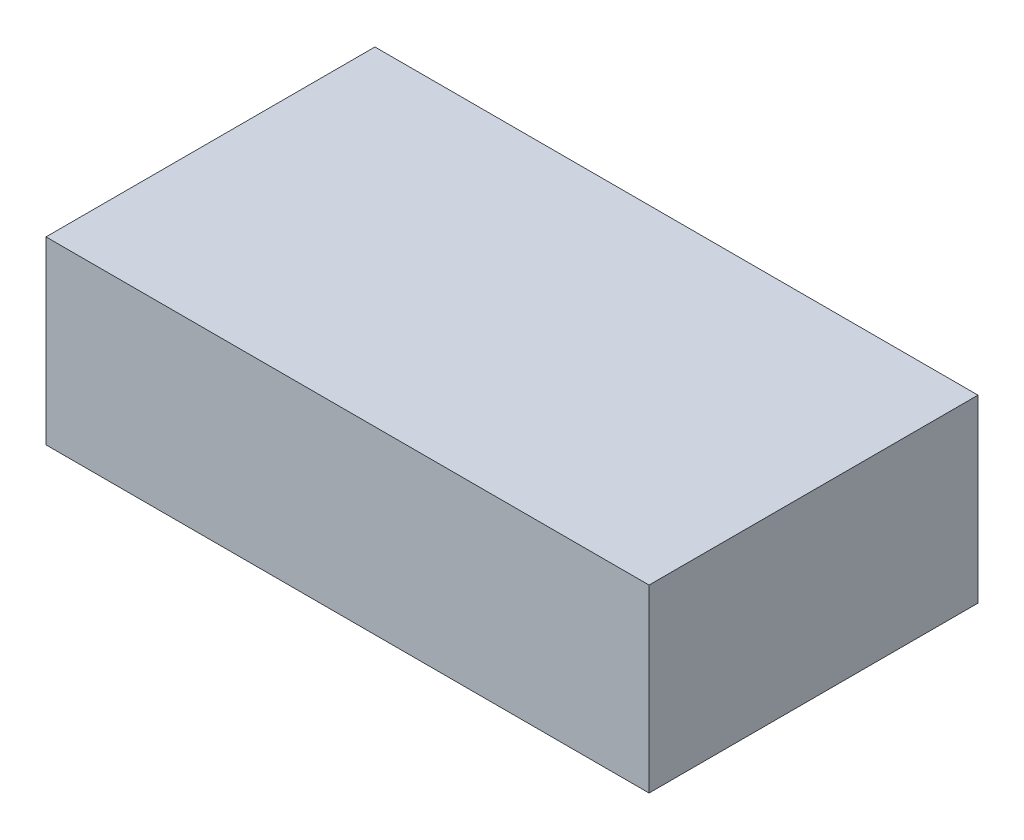
ISO-10303-21;
HEADER;
FILE_DESCRIPTION(('STEP AP214'),'2;1');
FILE_NAME('part.step','',(''),(''),'','','');
FILE_SCHEMA(('AUTOMOTIVE_DESIGN { 1 0 10303 214 1 1 1 1 }'));
ENDSEC;
DATA;
#1=APPLICATION_CONTEXT('core data for automotive mechanical design processes');
#2=APPLICATION_PROTOCOL_DEFINITION('international standard','automotive_design',2000,#1);
#3=PRODUCT_CONTEXT('',#1,'mechanical');
#4=PRODUCT('Part','Part','',(#3));
#5=PRODUCT_RELATED_PRODUCT_CATEGORY('part','',(#4));
#6=PRODUCT_DEFINITION_FORMATION('','',#4);
#7=PRODUCT_DEFINITION_CONTEXT('part definition',#1,'design');
#8=PRODUCT_DEFINITION('design','',#6,#7);
#9=PRODUCT_DEFINITION_SHAPE('','',#8);
#10=(LENGTH_UNIT() NAMED_UNIT(*) SI_UNIT(.MILLI.,.METRE.));
#11=(NAMED_UNIT(*) PLANE_ANGLE_UNIT() SI_UNIT($,.RADIAN.));
#12=(NAMED_UNIT(*) SI_UNIT($,.STERADIAN.) SOLID_ANGLE_UNIT());
#13=UNCERTAINTY_MEASURE_WITH_UNIT(LENGTH_MEASURE(1.E-05),#10,'distance_accuracy_value','');
#14=(GEOMETRIC_REPRESENTATION_CONTEXT(3) GLOBAL_UNCERTAINTY_ASSIGNED_CONTEXT((#13)) GLOBAL_UNIT_ASSIGNED_CONTEXT((#10,
#11,#12)) REPRESENTATION_CONTEXT('',''));
#15=CARTESIAN_POINT('',(0.,0.,0.));
#16=DIRECTION('',(0.,0.,1.));
#17=DIRECTION('',(1.,0.,0.));
#18=AXIS2_PLACEMENT_3D('',#15,#16,#17);
#19=CARTESIAN_POINT('',(38.5,23.,-21.));
#20=DIRECTION('',(-1.,0.,0.));
#21=DIRECTION('',(0.,0.,1.));
#22=AXIS2_PLACEMENT_3D('',#19,#20,#21);
#23=PLANE('',#22);
#24=DIRECTION('',(0.,0.,-1.));
#25=VECTOR('',#24,1.);
#26=CARTESIAN_POINT('',(38.5,0.,-21.));
#27=LINE('',#26,#25);
#28=CARTESIAN_POINT('',(38.5,0.,21.));
#29=VERTEX_POINT('',#28);
#30=CARTESIAN_POINT('',(38.5,0.,-21.));
#31=VERTEX_POINT('',#30);
#32=EDGE_CURVE('E96',#29,#31,#27,.T.);
#33=ORIENTED_EDGE('',*,*,#32,.T.);
#34=DIRECTION('',(0.,-1.,0.));
#35=VECTOR('',#34,1.);
#36=CARTESIAN_POINT('',(38.5,23.,-21.));
#37=LINE('',#36,#35);
#38=CARTESIAN_POINT('',(38.5,23.,-21.));
#39=VERTEX_POINT('',#38);
#40=EDGE_CURVE('E11',#39,#31,#37,.T.);
#41=ORIENTED_EDGE('',*,*,#40,.F.);
#42=DIRECTION('',(0.,0.,-1.));
#43=VECTOR('',#42,1.);
#44=CARTESIAN_POINT('',(38.5,23.,-21.));
#45=LINE('',#44,#43);
#46=CARTESIAN_POINT('',(38.5,23.,21.));
#47=VERTEX_POINT('',#46);
#48=EDGE_CURVE('E84',#47,#39,#45,.T.);
#49=ORIENTED_EDGE('',*,*,#48,.F.);
#50=DIRECTION('',(0.,-1.,0.));
#51=VECTOR('',#50,1.);
#52=CARTESIAN_POINT('',(38.5,23.,21.));
#53=LINE('',#52,#51);
#54=EDGE_CURVE('E92',#47,#29,#53,.T.);
#55=ORIENTED_EDGE('',*,*,#54,.T.);
#56=EDGE_LOOP('',(#33,#41,#49,#55));
#57=FACE_BOUND('',#56,.T.);
#58=ADVANCED_FACE('F33',(#57),#23,.F.);
#59=CARTESIAN_POINT('',(-38.5,23.,-21.));
#60=DIRECTION('',(0.,0.,1.));
#61=DIRECTION('',(1.,0.,0.));
#62=AXIS2_PLACEMENT_3D('',#59,#60,#61);
#63=PLANE('',#62);
#64=DIRECTION('',(-1.,0.,0.));
#65=VECTOR('',#64,1.);
#66=CARTESIAN_POINT('',(-38.5,0.,-21.));
#67=LINE('',#66,#65);
#68=CARTESIAN_POINT('',(-38.5,0.,-21.));
#69=VERTEX_POINT('',#68);
#70=EDGE_CURVE('E88',#31,#69,#67,.T.);
#71=ORIENTED_EDGE('',*,*,#70,.T.);
#72=DIRECTION('',(0.,-1.,0.));
#73=VECTOR('',#72,1.);
#74=CARTESIAN_POINT('',(-38.5,23.,-21.));
#75=LINE('',#74,#73);
#76=CARTESIAN_POINT('',(-38.5,23.,-21.));
#77=VERTEX_POINT('',#76);
#78=EDGE_CURVE('E41',#77,#69,#75,.T.);
#79=ORIENTED_EDGE('',*,*,#78,.F.);
#80=DIRECTION('',(-1.,0.,0.));
#81=VECTOR('',#80,1.);
#82=CARTESIAN_POINT('',(-38.5,23.,-21.));
#83=LINE('',#82,#81);
#84=EDGE_CURVE('E79',#39,#77,#83,.T.);
#85=ORIENTED_EDGE('',*,*,#84,.F.);
#86=ORIENTED_EDGE('',*,*,#40,.T.);
#87=EDGE_LOOP('',(#71,#79,#85,#86));
#88=FACE_BOUND('',#87,.T.);
#89=ADVANCED_FACE('F87',(#88),#63,.F.);
#90=CARTESIAN_POINT('',(-38.5,23.,-21.));
#91=DIRECTION('',(1.,0.,0.));
#92=DIRECTION('',(0.,0.,-1.));
#93=AXIS2_PLACEMENT_3D('',#90,#91,#92);
#94=PLANE('',#93);
#95=DIRECTION('',(0.,0.,1.));
#96=VECTOR('',#95,1.);
#97=CARTESIAN_POINT('',(-38.5,0.,-21.));
#98=LINE('',#97,#96);
#99=CARTESIAN_POINT('',(-38.5,0.,21.));
#100=VERTEX_POINT('',#99);
#101=EDGE_CURVE('E66',#69,#100,#98,.T.);
#102=ORIENTED_EDGE('',*,*,#101,.T.);
#103=DIRECTION('',(0.,-1.,0.));
#104=VECTOR('',#103,1.);
#105=CARTESIAN_POINT('',(-38.5,23.,21.));
#106=LINE('',#105,#104);
#107=CARTESIAN_POINT('',(-38.5,23.,21.));
#108=VERTEX_POINT('',#107);
#109=EDGE_CURVE('E89',#108,#100,#106,.T.);
#110=ORIENTED_EDGE('',*,*,#109,.F.);
#111=DIRECTION('',(0.,0.,1.));
#112=VECTOR('',#111,1.);
#113=CARTESIAN_POINT('',(-38.5,23.,-21.));
#114=LINE('',#113,#112);
#115=EDGE_CURVE('E82',#77,#108,#114,.T.);
#116=ORIENTED_EDGE('',*,*,#115,.F.);
#117=ORIENTED_EDGE('',*,*,#78,.T.);
#118=EDGE_LOOP('',(#102,#110,#116,#117));
#119=FACE_BOUND('',#118,.T.);
#120=ADVANCED_FACE('F90',(#119),#94,.F.);
#121=CARTESIAN_POINT('',(-38.5,23.,21.));
#122=DIRECTION('',(0.,0.,-1.));
#123=DIRECTION('',(-1.,0.,0.));
#124=AXIS2_PLACEMENT_3D('',#121,#122,#123);
#125=PLANE('',#124);
#126=DIRECTION('',(1.,0.,0.));
#127=VECTOR('',#126,1.);
#128=CARTESIAN_POINT('',(-38.5,0.,21.));
#129=LINE('',#128,#127);
#130=EDGE_CURVE('E72',#100,#29,#129,.T.);
#131=ORIENTED_EDGE('',*,*,#130,.T.);
#132=ORIENTED_EDGE('',*,*,#54,.F.);
#133=DIRECTION('',(1.,0.,0.));
#134=VECTOR('',#133,1.);
#135=CARTESIAN_POINT('',(-38.5,23.,21.));
#136=LINE('',#135,#134);
#137=EDGE_CURVE('E49',#108,#47,#136,.T.);
#138=ORIENTED_EDGE('',*,*,#137,.F.);
#139=ORIENTED_EDGE('',*,*,#109,.T.);
#140=EDGE_LOOP('',(#131,#132,#138,#139));
#141=FACE_BOUND('',#140,.T.);
#142=ADVANCED_FACE('F103',(#141),#125,.F.);
#143=CARTESIAN_POINT('',(0.,23.,0.));
#144=DIRECTION('',(0.,1.,0.));
#145=DIRECTION('',(0.,0.,1.));
#146=AXIS2_PLACEMENT_3D('',#143,#144,#145);
#147=PLANE('',#146);
#148=ORIENTED_EDGE('',*,*,#48,.T.);
#149=ORIENTED_EDGE('',*,*,#84,.T.);
#150=ORIENTED_EDGE('',*,*,#115,.T.);
#151=ORIENTED_EDGE('',*,*,#137,.T.);
#152=EDGE_LOOP('',(#148,#149,#150,#151));
#153=FACE_BOUND('',#152,.T.);
#154=ADVANCED_FACE('F80',(#153),#147,.T.);
#155=CARTESIAN_POINT('',(0.,0.,0.));
#156=DIRECTION('',(0.,1.,0.));
#157=DIRECTION('',(0.,0.,1.));
#158=AXIS2_PLACEMENT_3D('',#155,#156,#157);
#159=PLANE('',#158);
#160=ORIENTED_EDGE('',*,*,#32,.F.);
#161=ORIENTED_EDGE('',*,*,#130,.F.);
#162=ORIENTED_EDGE('',*,*,#101,.F.);
#163=ORIENTED_EDGE('',*,*,#70,.F.);
#164=EDGE_LOOP('',(#160,#161,#162,#163));
#165=FACE_BOUND('',#164,.T.);
#166=ADVANCED_FACE('F106',(#165),#159,.F.);
#167=CLOSED_SHELL('',(#58,#89,#120,#142,#154,#166));
#168=MANIFOLD_SOLID_BREP('B2',#167);
#169=ADVANCED_BREP_SHAPE_REPRESENTATION('',(#18,#168),#14);
#170=SHAPE_DEFINITION_REPRESENTATION(#9,#169);
ENDSEC;
END-ISO-10303-21;
